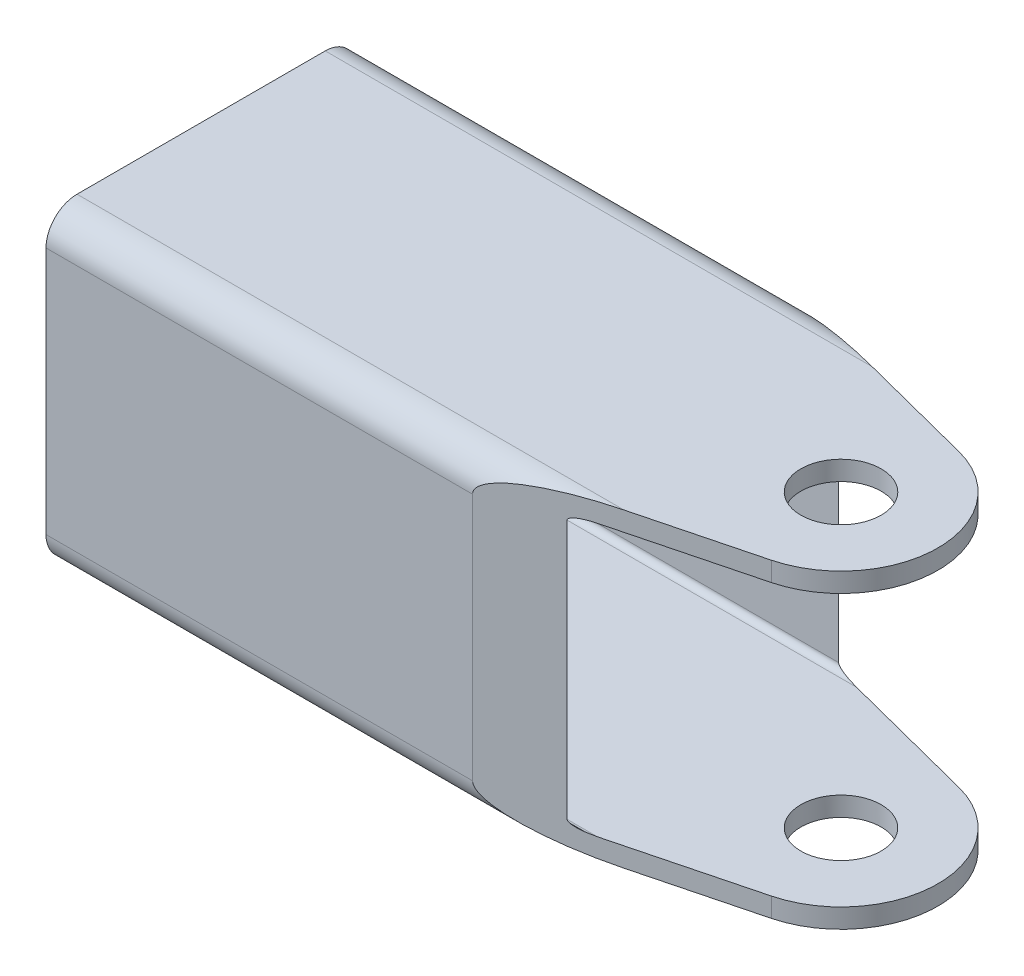
ISO-10303-21;
HEADER;
FILE_DESCRIPTION(('STEP AP214'),'2;1');
FILE_NAME('part.step','',(''),(''),'','','');
FILE_SCHEMA(('AUTOMOTIVE_DESIGN { 1 0 10303 214 1 1 1 1 }'));
ENDSEC;
DATA;
#1=APPLICATION_CONTEXT('core data for automotive mechanical design processes');
#2=APPLICATION_PROTOCOL_DEFINITION('international standard','automotive_design',2000,#1);
#3=PRODUCT_CONTEXT('',#1,'mechanical');
#4=PRODUCT('Part','Part','',(#3));
#5=PRODUCT_RELATED_PRODUCT_CATEGORY('part','',(#4));
#6=PRODUCT_DEFINITION_FORMATION('','',#4);
#7=PRODUCT_DEFINITION_CONTEXT('part definition',#1,'design');
#8=PRODUCT_DEFINITION('design','',#6,#7);
#9=PRODUCT_DEFINITION_SHAPE('','',#8);
#10=(LENGTH_UNIT() NAMED_UNIT(*) SI_UNIT(.MILLI.,.METRE.));
#11=(NAMED_UNIT(*) PLANE_ANGLE_UNIT() SI_UNIT($,.RADIAN.));
#12=(NAMED_UNIT(*) SI_UNIT($,.STERADIAN.) SOLID_ANGLE_UNIT());
#13=UNCERTAINTY_MEASURE_WITH_UNIT(LENGTH_MEASURE(1.E-05),#10,'distance_accuracy_value','');
#14=(GEOMETRIC_REPRESENTATION_CONTEXT(3) GLOBAL_UNCERTAINTY_ASSIGNED_CONTEXT((#13)) GLOBAL_UNIT_ASSIGNED_CONTEXT((#10,
#11,#12)) REPRESENTATION_CONTEXT('',''));
#15=CARTESIAN_POINT('',(0.,0.,0.));
#16=DIRECTION('',(0.,0.,1.));
#17=DIRECTION('',(1.,0.,0.));
#18=AXIS2_PLACEMENT_3D('',#15,#16,#17);
#19=CARTESIAN_POINT('',(-34.925,12.7,10.16));
#20=DIRECTION('',(0.,1.,0.));
#21=DIRECTION('',(0.,0.,1.));
#22=AXIS2_PLACEMENT_3D('',#19,#20,#21);
#23=PLANE('',#22);
#24=CARTESIAN_POINT('',(17.4625,12.7,0.));
#25=DIRECTION('',(0.,1.,0.));
#26=DIRECTION('',(0.,0.,1.));
#27=AXIS2_PLACEMENT_3D('',#24,#25,#26);
#28=CIRCLE('',#27,3.2893);
#29=CARTESIAN_POINT('',(17.4625,12.7,3.2893));
#30=VERTEX_POINT('',#29);
#31=EDGE_CURVE('E478',#30,#30,#28,.T.);
#32=ORIENTED_EDGE('',*,*,#31,.F.);
#33=EDGE_LOOP('',(#32));
#34=FACE_BOUND('',#33,.T.);
#35=CARTESIAN_POINT('',(17.4625,12.7,0.));
#36=DIRECTION('',(0.,1.,0.));
#37=DIRECTION('',(0.,0.,1.));
#38=AXIS2_PLACEMENT_3D('',#35,#36,#37);
#39=CIRCLE('',#38,7.9375);
#40=CARTESIAN_POINT('',(19.4444244631501,12.7,7.68608363683138));
#41=VERTEX_POINT('',#40);
#42=CARTESIAN_POINT('',(19.4444244631501,12.7,-7.68608363683139));
#43=VERTEX_POINT('',#42);
#44=EDGE_CURVE('E203',#41,#43,#39,.T.);
#45=ORIENTED_EDGE('',*,*,#44,.T.);
#46=DIRECTION('',(-0.968325497553561,0.,-0.249691270948044));
#47=VECTOR('',#46,1.);
#48=CARTESIAN_POINT('',(3.07063678702942,12.7,-11.9082092189968));
#49=LINE('',#48,#47);
#50=CARTESIAN_POINT('',(9.85035141375773,12.7,-10.16));
#51=VERTEX_POINT('',#50);
#52=EDGE_CURVE('E210',#43,#51,#49,.T.);
#53=ORIENTED_EDGE('',*,*,#52,.T.);
#54=DIRECTION('',(1.,0.,0.));
#55=VECTOR('',#54,1.);
#56=CARTESIAN_POINT('',(-34.925,12.7,-10.16));
#57=LINE('',#56,#55);
#58=CARTESIAN_POINT('',(-34.925,12.7,-10.16));
#59=VERTEX_POINT('',#58);
#60=EDGE_CURVE('E321',#59,#51,#57,.T.);
#61=ORIENTED_EDGE('',*,*,#60,.F.);
#62=DIRECTION('',(0.,0.,1.));
#63=VECTOR('',#62,1.);
#64=CARTESIAN_POINT('',(-34.925,12.7,10.16));
#65=LINE('',#64,#63);
#66=CARTESIAN_POINT('',(-34.925,12.7,10.16));
#67=VERTEX_POINT('',#66);
#68=EDGE_CURVE('E313',#59,#67,#65,.T.);
#69=ORIENTED_EDGE('',*,*,#68,.T.);
#70=DIRECTION('',(1.,0.,0.));
#71=VECTOR('',#70,1.);
#72=CARTESIAN_POINT('',(-34.925,12.7,10.16));
#73=LINE('',#72,#71);
#74=CARTESIAN_POINT('',(9.85035141375776,12.7,10.16));
#75=VERTEX_POINT('',#74);
#76=EDGE_CURVE('E317',#67,#75,#73,.T.);
#77=ORIENTED_EDGE('',*,*,#76,.T.);
#78=DIRECTION('',(-0.96832549755356,0.,0.249691270948044));
#79=VECTOR('',#78,1.);
#80=CARTESIAN_POINT('',(3.07063678702943,12.7,11.9082092189969));
#81=LINE('',#80,#79);
#82=EDGE_CURVE('E201',#41,#75,#81,.T.);
#83=ORIENTED_EDGE('',*,*,#82,.F.);
#84=EDGE_LOOP('',(#45,#53,#61,#69,#77,#83));
#85=FACE_BOUND('',#84,.T.);
#86=ADVANCED_FACE('F36',(#34,#85),#23,.T.);
#87=CARTESIAN_POINT('',(-34.925,10.16,-10.16));
#88=DIRECTION('',(1.,0.,0.));
#89=DIRECTION('',(0.,0.,-1.));
#90=AXIS2_PLACEMENT_3D('',#87,#88,#89);
#91=CYLINDRICAL_SURFACE('',#90,2.54);
#92=ORIENTED_EDGE('',*,*,#60,.T.);
#93=CARTESIAN_POINT('',(9.85035141375777,10.16,-10.16));
#94=DIRECTION('',(0.249691270948044,0.,-0.968325497553561));
#95=DIRECTION('',(0.968325497553561,0.,0.249691270948044));
#96=AXIS2_PLACEMENT_3D('',#93,#94,#95);
#97=ELLIPSE('',#96,10.1725622620125,2.54);
#98=CARTESIAN_POINT('',(0.,10.16,-12.7));
#99=VERTEX_POINT('',#98);
#100=EDGE_CURVE('E245',#51,#99,#97,.F.);
#101=ORIENTED_EDGE('',*,*,#100,.T.);
#102=DIRECTION('',(1.,0.,0.));
#103=VECTOR('',#102,1.);
#104=CARTESIAN_POINT('',(-34.925,10.16,-12.7));
#105=LINE('',#104,#103);
#106=CARTESIAN_POINT('',(-34.925,10.16,-12.7));
#107=VERTEX_POINT('',#106);
#108=EDGE_CURVE('E324',#107,#99,#105,.T.);
#109=ORIENTED_EDGE('',*,*,#108,.F.);
#110=CARTESIAN_POINT('',(-34.925,10.16,-10.16));
#111=DIRECTION('',(1.,0.,0.));
#112=DIRECTION('',(0.,0.,1.));
#113=AXIS2_PLACEMENT_3D('',#110,#111,#112);
#114=CIRCLE('',#113,2.54);
#115=EDGE_CURVE('E310',#107,#59,#114,.T.);
#116=ORIENTED_EDGE('',*,*,#115,.T.);
#117=EDGE_LOOP('',(#92,#101,#109,#116));
#118=FACE_BOUND('',#117,.T.);
#119=ADVANCED_FACE('F388',(#118),#91,.T.);
#120=CARTESIAN_POINT('',(-34.925,10.16,-12.7));
#121=DIRECTION('',(0.,0.,-1.));
#122=DIRECTION('',(-1.,0.,0.));
#123=AXIS2_PLACEMENT_3D('',#120,#121,#122);
#124=PLANE('',#123);
#125=ORIENTED_EDGE('',*,*,#108,.T.);
#126=DIRECTION('',(0.,1.,0.));
#127=VECTOR('',#126,1.);
#128=CARTESIAN_POINT('',(0.,-12.7,-12.7));
#129=LINE('',#128,#127);
#130=CARTESIAN_POINT('',(0.,-10.16,-12.7));
#131=VERTEX_POINT('',#130);
#132=EDGE_CURVE('E214',#131,#99,#129,.T.);
#133=ORIENTED_EDGE('',*,*,#132,.F.);
#134=DIRECTION('',(1.,0.,0.));
#135=VECTOR('',#134,1.);
#136=CARTESIAN_POINT('',(-34.925,-10.16,-12.7));
#137=LINE('',#136,#135);
#138=CARTESIAN_POINT('',(-34.925,-10.16,-12.7));
#139=VERTEX_POINT('',#138);
#140=EDGE_CURVE('E327',#139,#131,#137,.T.);
#141=ORIENTED_EDGE('',*,*,#140,.F.);
#142=DIRECTION('',(0.,1.,0.));
#143=VECTOR('',#142,1.);
#144=CARTESIAN_POINT('',(-34.925,10.16,-12.7));
#145=LINE('',#144,#143);
#146=EDGE_CURVE('E307',#139,#107,#145,.T.);
#147=ORIENTED_EDGE('',*,*,#146,.T.);
#148=EDGE_LOOP('',(#125,#133,#141,#147));
#149=FACE_BOUND('',#148,.T.);
#150=ADVANCED_FACE('F391',(#149),#124,.T.);
#151=CARTESIAN_POINT('',(-34.925,-10.16,-10.16));
#152=DIRECTION('',(1.,0.,0.));
#153=DIRECTION('',(0.,0.,-1.));
#154=AXIS2_PLACEMENT_3D('',#151,#152,#153);
#155=CYLINDRICAL_SURFACE('',#154,2.54);
#156=ORIENTED_EDGE('',*,*,#140,.T.);
#157=CARTESIAN_POINT('',(9.85035141375777,-10.16,-10.16));
#158=DIRECTION('',(0.249691270948044,0.,-0.968325497553561));
#159=DIRECTION('',(0.968325497553561,0.,0.249691270948044));
#160=AXIS2_PLACEMENT_3D('',#157,#158,#159);
#161=ELLIPSE('',#160,10.1725622620125,2.54);
#162=CARTESIAN_POINT('',(9.85035141375775,-12.7,-10.16));
#163=VERTEX_POINT('',#162);
#164=EDGE_CURVE('E243',#131,#163,#161,.F.);
#165=ORIENTED_EDGE('',*,*,#164,.T.);
#166=DIRECTION('',(1.,0.,0.));
#167=VECTOR('',#166,1.);
#168=CARTESIAN_POINT('',(-34.925,-12.7,-10.16));
#169=LINE('',#168,#167);
#170=CARTESIAN_POINT('',(-34.925,-12.7,-10.16));
#171=VERTEX_POINT('',#170);
#172=EDGE_CURVE('E200',#171,#163,#169,.T.);
#173=ORIENTED_EDGE('',*,*,#172,.F.);
#174=CARTESIAN_POINT('',(-34.925,-10.16,-10.16));
#175=DIRECTION('',(1.,0.,0.));
#176=DIRECTION('',(0.,0.,1.));
#177=AXIS2_PLACEMENT_3D('',#174,#175,#176);
#178=CIRCLE('',#177,2.54);
#179=EDGE_CURVE('E304',#171,#139,#178,.T.);
#180=ORIENTED_EDGE('',*,*,#179,.T.);
#181=EDGE_LOOP('',(#156,#165,#173,#180));
#182=FACE_BOUND('',#181,.T.);
#183=ADVANCED_FACE('F394',(#182),#155,.T.);
#184=CARTESIAN_POINT('',(-34.925,-12.7,10.16));
#185=DIRECTION('',(0.,-1.,0.));
#186=DIRECTION('',(0.,0.,-1.));
#187=AXIS2_PLACEMENT_3D('',#184,#185,#186);
#188=PLANE('',#187);
#189=CARTESIAN_POINT('',(17.4625,-12.7,0.));
#190=DIRECTION('',(0.,1.,0.));
#191=DIRECTION('',(0.,0.,1.));
#192=AXIS2_PLACEMENT_3D('',#189,#190,#191);
#193=CIRCLE('',#192,3.2893);
#194=CARTESIAN_POINT('',(17.4625,-12.7,3.2893));
#195=VERTEX_POINT('',#194);
#196=EDGE_CURVE('E472',#195,#195,#193,.T.);
#197=ORIENTED_EDGE('',*,*,#196,.T.);
#198=EDGE_LOOP('',(#197));
#199=FACE_BOUND('',#198,.T.);
#200=ORIENTED_EDGE('',*,*,#172,.T.);
#201=DIRECTION('',(-0.968325497553561,0.,-0.249691270948044));
#202=VECTOR('',#201,1.);
#203=CARTESIAN_POINT('',(3.07063678702942,-12.7,-11.9082092189968));
#204=LINE('',#203,#202);
#205=CARTESIAN_POINT('',(19.4444244631501,-12.7,-7.68608363683138));
#206=VERTEX_POINT('',#205);
#207=EDGE_CURVE('E186',#206,#163,#204,.T.);
#208=ORIENTED_EDGE('',*,*,#207,.F.);
#209=CARTESIAN_POINT('',(17.4625,-12.7,0.));
#210=DIRECTION('',(0.,1.,0.));
#211=DIRECTION('',(0.,0.,1.));
#212=AXIS2_PLACEMENT_3D('',#209,#210,#211);
#213=CIRCLE('',#212,7.9375);
#214=CARTESIAN_POINT('',(19.4444244631501,-12.7,7.68608363683139));
#215=VERTEX_POINT('',#214);
#216=EDGE_CURVE('E174',#215,#206,#213,.T.);
#217=ORIENTED_EDGE('',*,*,#216,.F.);
#218=DIRECTION('',(-0.96832549755356,0.,0.249691270948044));
#219=VECTOR('',#218,1.);
#220=CARTESIAN_POINT('',(3.07063678702943,-12.7,11.9082092189969));
#221=LINE('',#220,#219);
#222=CARTESIAN_POINT('',(9.85035141375782,-12.7,10.16));
#223=VERTEX_POINT('',#222);
#224=EDGE_CURVE('E185',#215,#223,#221,.T.);
#225=ORIENTED_EDGE('',*,*,#224,.T.);
#226=DIRECTION('',(1.,0.,0.));
#227=VECTOR('',#226,1.);
#228=CARTESIAN_POINT('',(-34.925,-12.7,10.16));
#229=LINE('',#228,#227);
#230=CARTESIAN_POINT('',(-34.925,-12.7,10.16));
#231=VERTEX_POINT('',#230);
#232=EDGE_CURVE('E331',#231,#223,#229,.T.);
#233=ORIENTED_EDGE('',*,*,#232,.F.);
#234=DIRECTION('',(0.,0.,-1.));
#235=VECTOR('',#234,1.);
#236=CARTESIAN_POINT('',(-34.925,-12.7,10.16));
#237=LINE('',#236,#235);
#238=EDGE_CURVE('E302',#231,#171,#237,.T.);
#239=ORIENTED_EDGE('',*,*,#238,.T.);
#240=EDGE_LOOP('',(#200,#208,#217,#225,#233,#239));
#241=FACE_BOUND('',#240,.T.);
#242=ADVANCED_FACE('F198',(#199,#241),#188,.T.);
#243=CARTESIAN_POINT('',(-34.925,10.6045,-10.6045));
#244=DIRECTION('',(1.,0.,0.));
#245=DIRECTION('',(0.,0.,-1.));
#246=AXIS2_PLACEMENT_3D('',#243,#244,#245);
#247=CYLINDRICAL_SURFACE('',#246,0.508000000000001);
#248=CARTESIAN_POINT('',(8.12653991635016,10.6045,-10.6045));
#249=DIRECTION('',(0.249691270948044,0.,-0.968325497553561));
#250=DIRECTION('',(0.968325497553561,0.,0.249691270948044));
#251=AXIS2_PLACEMENT_3D('',#248,#249,#250);
#252=ELLIPSE('',#251,2.0345124524025,0.508000000000001);
#253=CARTESIAN_POINT('',(8.12653991635019,11.1125,-10.6045));
#254=VERTEX_POINT('',#253);
#255=CARTESIAN_POINT('',(6.15646963359859,10.6045,-11.1125));
#256=VERTEX_POINT('',#255);
#257=EDGE_CURVE('E236',#254,#256,#252,.F.);
#258=ORIENTED_EDGE('',*,*,#257,.F.);
#259=DIRECTION('',(1.,0.,0.));
#260=VECTOR('',#259,1.);
#261=CARTESIAN_POINT('',(-34.925,11.1125,-10.6045));
#262=LINE('',#261,#260);
#263=CARTESIAN_POINT('',(-34.925,11.1125,-10.6045));
#264=VERTEX_POINT('',#263);
#265=EDGE_CURVE('E270',#264,#254,#262,.T.);
#266=ORIENTED_EDGE('',*,*,#265,.F.);
#267=CARTESIAN_POINT('',(-34.925,10.6045,-10.6045));
#268=DIRECTION('',(1.,0.,0.));
#269=DIRECTION('',(0.,0.,1.));
#270=AXIS2_PLACEMENT_3D('',#267,#268,#269);
#271=CIRCLE('',#270,0.508000000000001);
#272=CARTESIAN_POINT('',(-34.925,10.6045,-11.1125));
#273=VERTEX_POINT('',#272);
#274=EDGE_CURVE('E248',#273,#264,#271,.T.);
#275=ORIENTED_EDGE('',*,*,#274,.F.);
#276=DIRECTION('',(1.,0.,0.));
#277=VECTOR('',#276,1.);
#278=CARTESIAN_POINT('',(-34.925,10.6045,-11.1125));
#279=LINE('',#278,#277);
#280=EDGE_CURVE('E271',#273,#256,#279,.T.);
#281=ORIENTED_EDGE('',*,*,#280,.T.);
#282=EDGE_LOOP('',(#258,#266,#275,#281));
#283=FACE_BOUND('',#282,.T.);
#284=ADVANCED_FACE('F358',(#283),#247,.F.);
#285=CARTESIAN_POINT('',(-34.925,10.6045,-11.1125));
#286=DIRECTION('',(0.,0.,-1.));
#287=DIRECTION('',(0.,1.,0.));
#288=AXIS2_PLACEMENT_3D('',#285,#286,#287);
#289=PLANE('',#288);
#290=DIRECTION('',(0.,-1.,0.));
#291=VECTOR('',#290,1.);
#292=CARTESIAN_POINT('',(6.1564696335986,10.6045,-11.1125));
#293=LINE('',#292,#291);
#294=CARTESIAN_POINT('',(6.15646963359857,-10.6045,-11.1125));
#295=VERTEX_POINT('',#294);
#296=EDGE_CURVE('E238',#256,#295,#293,.T.);
#297=ORIENTED_EDGE('',*,*,#296,.F.);
#298=ORIENTED_EDGE('',*,*,#280,.F.);
#299=DIRECTION('',(0.,1.,0.));
#300=VECTOR('',#299,1.);
#301=CARTESIAN_POINT('',(-34.925,10.6045,-11.1125));
#302=LINE('',#301,#300);
#303=CARTESIAN_POINT('',(-34.925,-10.6045,-11.1125));
#304=VERTEX_POINT('',#303);
#305=EDGE_CURVE('E267',#304,#273,#302,.T.);
#306=ORIENTED_EDGE('',*,*,#305,.F.);
#307=DIRECTION('',(1.,0.,0.));
#308=VECTOR('',#307,1.);
#309=CARTESIAN_POINT('',(-34.925,-10.6045,-11.1125));
#310=LINE('',#309,#308);
#311=EDGE_CURVE('E275',#304,#295,#310,.T.);
#312=ORIENTED_EDGE('',*,*,#311,.T.);
#313=EDGE_LOOP('',(#297,#298,#306,#312));
#314=FACE_BOUND('',#313,.T.);
#315=ADVANCED_FACE('F363',(#314),#289,.F.);
#316=CARTESIAN_POINT('',(-34.925,-10.6045,-10.6045));
#317=DIRECTION('',(1.,0.,0.));
#318=DIRECTION('',(0.,0.,-1.));
#319=AXIS2_PLACEMENT_3D('',#316,#317,#318);
#320=CYLINDRICAL_SURFACE('',#319,0.508);
#321=CARTESIAN_POINT('',(8.12653991635013,-10.6045,-10.6045));
#322=DIRECTION('',(0.249691270948044,0.,-0.968325497553561));
#323=DIRECTION('',(0.968325497553561,0.,0.249691270948044));
#324=AXIS2_PLACEMENT_3D('',#321,#322,#323);
#325=ELLIPSE('',#324,2.03451245240249,0.508);
#326=CARTESIAN_POINT('',(8.12653991635014,-11.1125,-10.6045));
#327=VERTEX_POINT('',#326);
#328=EDGE_CURVE('E240',#295,#327,#325,.F.);
#329=ORIENTED_EDGE('',*,*,#328,.F.);
#330=ORIENTED_EDGE('',*,*,#311,.F.);
#331=CARTESIAN_POINT('',(-34.925,-10.6045,-10.6045));
#332=DIRECTION('',(1.,0.,0.));
#333=DIRECTION('',(0.,0.,-1.));
#334=AXIS2_PLACEMENT_3D('',#331,#332,#333);
#335=CIRCLE('',#334,0.508);
#336=CARTESIAN_POINT('',(-34.925,-11.1125,-10.6045));
#337=VERTEX_POINT('',#336);
#338=EDGE_CURVE('E264',#337,#304,#335,.T.);
#339=ORIENTED_EDGE('',*,*,#338,.F.);
#340=DIRECTION('',(1.,0.,0.));
#341=VECTOR('',#340,1.);
#342=CARTESIAN_POINT('',(-34.925,-11.1125,-10.6045));
#343=LINE('',#342,#341);
#344=EDGE_CURVE('E278',#337,#327,#343,.T.);
#345=ORIENTED_EDGE('',*,*,#344,.T.);
#346=EDGE_LOOP('',(#329,#330,#339,#345));
#347=FACE_BOUND('',#346,.T.);
#348=ADVANCED_FACE('F367',(#347),#320,.F.);
#349=CARTESIAN_POINT('',(-34.925,-11.1125,10.6045));
#350=DIRECTION('',(0.,-1.,0.));
#351=DIRECTION('',(0.,0.,-1.));
#352=AXIS2_PLACEMENT_3D('',#349,#350,#351);
#353=PLANE('',#352);
#354=CARTESIAN_POINT('',(17.4625,-11.1125,0.));
#355=DIRECTION('',(0.,-1.,0.));
#356=DIRECTION('',(0.,0.,-1.));
#357=AXIS2_PLACEMENT_3D('',#354,#355,#356);
#358=CIRCLE('',#357,3.2893);
#359=CARTESIAN_POINT('',(17.4625,-11.1125,-3.2893));
#360=VERTEX_POINT('',#359);
#361=EDGE_CURVE('E206',#360,#360,#358,.T.);
#362=ORIENTED_EDGE('',*,*,#361,.T.);
#363=EDGE_LOOP('',(#362));
#364=FACE_BOUND('',#363,.T.);
#365=DIRECTION('',(0.968325497553561,0.,0.249691270948044));
#366=VECTOR('',#365,1.);
#367=CARTESIAN_POINT('',(-27.1129568480424,-11.1125,-19.6913150811901));
#368=LINE('',#367,#366);
#369=CARTESIAN_POINT('',(19.4444244631501,-11.1125,-7.68608363683138));
#370=VERTEX_POINT('',#369);
#371=EDGE_CURVE('E193',#327,#370,#368,.T.);
#372=ORIENTED_EDGE('',*,*,#371,.F.);
#373=ORIENTED_EDGE('',*,*,#344,.F.);
#374=DIRECTION('',(0.,0.,-1.));
#375=VECTOR('',#374,1.);
#376=CARTESIAN_POINT('',(-34.925,-11.1125,10.6045));
#377=LINE('',#376,#375);
#378=CARTESIAN_POINT('',(-34.925,-11.1125,10.6045));
#379=VERTEX_POINT('',#378);
#380=EDGE_CURVE('E261',#379,#337,#377,.T.);
#381=ORIENTED_EDGE('',*,*,#380,.F.);
#382=DIRECTION('',(1.,0.,0.));
#383=VECTOR('',#382,1.);
#384=CARTESIAN_POINT('',(-34.925,-11.1125,10.6045));
#385=LINE('',#384,#383);
#386=CARTESIAN_POINT('',(8.12653991635018,-11.1125,10.6045));
#387=VERTEX_POINT('',#386);
#388=EDGE_CURVE('E281',#379,#387,#385,.T.);
#389=ORIENTED_EDGE('',*,*,#388,.T.);
#390=DIRECTION('',(0.96832549755356,0.,-0.249691270948044));
#391=VECTOR('',#390,1.);
#392=CARTESIAN_POINT('',(-32.2409202823815,-11.1125,21.0136056854654));
#393=LINE('',#392,#391);
#394=CARTESIAN_POINT('',(19.4444244631501,-11.1125,7.68608363683139));
#395=VERTEX_POINT('',#394);
#396=EDGE_CURVE('E230',#387,#395,#393,.T.);
#397=ORIENTED_EDGE('',*,*,#396,.T.);
#398=CARTESIAN_POINT('',(17.4625,-11.1125,0.));
#399=DIRECTION('',(0.,-1.,0.));
#400=DIRECTION('',(0.,0.,-1.));
#401=AXIS2_PLACEMENT_3D('',#398,#399,#400);
#402=CIRCLE('',#401,7.9375);
#403=EDGE_CURVE('E216',#370,#395,#402,.T.);
#404=ORIENTED_EDGE('',*,*,#403,.F.);
#405=EDGE_LOOP('',(#372,#373,#381,#389,#397,#404));
#406=FACE_BOUND('',#405,.T.);
#407=ADVANCED_FACE('F369',(#364,#406),#353,.F.);
#408=CARTESIAN_POINT('',(-34.925,11.1125,10.6045));
#409=DIRECTION('',(0.,1.,0.));
#410=DIRECTION('',(0.,0.,1.));
#411=AXIS2_PLACEMENT_3D('',#408,#409,#410);
#412=PLANE('',#411);
#413=CARTESIAN_POINT('',(17.4625,11.1125,0.));
#414=DIRECTION('',(0.,1.,0.));
#415=DIRECTION('',(0.,0.,1.));
#416=AXIS2_PLACEMENT_3D('',#413,#414,#415);
#417=CIRCLE('',#416,3.2893);
#418=CARTESIAN_POINT('',(17.4625,11.1125,3.2893));
#419=VERTEX_POINT('',#418);
#420=EDGE_CURVE('E40',#419,#419,#417,.T.);
#421=ORIENTED_EDGE('',*,*,#420,.T.);
#422=EDGE_LOOP('',(#421));
#423=FACE_BOUND('',#422,.T.);
#424=DIRECTION('',(-0.968325497553561,0.,-0.249691270948044));
#425=VECTOR('',#424,1.);
#426=CARTESIAN_POINT('',(-27.1129568480424,11.1125,-19.6913150811901));
#427=LINE('',#426,#425);
#428=CARTESIAN_POINT('',(19.4444244631501,11.1125,-7.68608363683139));
#429=VERTEX_POINT('',#428);
#430=EDGE_CURVE('E11',#429,#254,#427,.T.);
#431=ORIENTED_EDGE('',*,*,#430,.F.);
#432=CARTESIAN_POINT('',(17.4625,11.1125,0.));
#433=DIRECTION('',(0.,1.,0.));
#434=DIRECTION('',(0.,0.,1.));
#435=AXIS2_PLACEMENT_3D('',#432,#433,#434);
#436=CIRCLE('',#435,7.9375);
#437=CARTESIAN_POINT('',(19.4444244631501,11.1125,7.68608363683138));
#438=VERTEX_POINT('',#437);
#439=EDGE_CURVE('E320',#438,#429,#436,.T.);
#440=ORIENTED_EDGE('',*,*,#439,.F.);
#441=DIRECTION('',(-0.96832549755356,0.,0.249691270948044));
#442=VECTOR('',#441,1.);
#443=CARTESIAN_POINT('',(-32.2409202823815,11.1125,21.0136056854654));
#444=LINE('',#443,#442);
#445=CARTESIAN_POINT('',(8.12653991635014,11.1125,10.6045));
#446=VERTEX_POINT('',#445);
#447=EDGE_CURVE('E45',#438,#446,#444,.T.);
#448=ORIENTED_EDGE('',*,*,#447,.T.);
#449=DIRECTION('',(1.,0.,0.));
#450=VECTOR('',#449,1.);
#451=CARTESIAN_POINT('',(-34.925,11.1125,10.6045));
#452=LINE('',#451,#450);
#453=CARTESIAN_POINT('',(-34.925,11.1125,10.6045));
#454=VERTEX_POINT('',#453);
#455=EDGE_CURVE('E290',#454,#446,#452,.T.);
#456=ORIENTED_EDGE('',*,*,#455,.F.);
#457=DIRECTION('',(0.,0.,1.));
#458=VECTOR('',#457,1.);
#459=CARTESIAN_POINT('',(-34.925,11.1125,10.6045));
#460=LINE('',#459,#458);
#461=EDGE_CURVE('E251',#264,#454,#460,.T.);
#462=ORIENTED_EDGE('',*,*,#461,.F.);
#463=ORIENTED_EDGE('',*,*,#265,.T.);
#464=EDGE_LOOP('',(#431,#440,#448,#456,#462,#463));
#465=FACE_BOUND('',#464,.T.);
#466=ADVANCED_FACE('F344',(#423,#465),#412,.F.);
#467=CARTESIAN_POINT('',(-34.925,10.16,10.16));
#468=DIRECTION('',(1.,0.,0.));
#469=DIRECTION('',(0.,0.,-1.));
#470=AXIS2_PLACEMENT_3D('',#467,#468,#469);
#471=CYLINDRICAL_SURFACE('',#470,2.54);
#472=CARTESIAN_POINT('',(9.85035141375779,10.16,10.16));
#473=DIRECTION('',(-0.249691270948044,0.,-0.96832549755356));
#474=DIRECTION('',(0.96832549755356,0.,-0.249691270948044));
#475=AXIS2_PLACEMENT_3D('',#472,#473,#474);
#476=ELLIPSE('',#475,10.1725622620125,2.54);
#477=CARTESIAN_POINT('',(0.,10.16,12.7));
#478=VERTEX_POINT('',#477);
#479=EDGE_CURVE('E52',#75,#478,#476,.F.);
#480=ORIENTED_EDGE('',*,*,#479,.F.);
#481=ORIENTED_EDGE('',*,*,#76,.F.);
#482=CARTESIAN_POINT('',(-34.925,10.16,10.16));
#483=DIRECTION('',(1.,0.,0.));
#484=DIRECTION('',(0.,0.,-1.));
#485=AXIS2_PLACEMENT_3D('',#482,#483,#484);
#486=CIRCLE('',#485,2.54);
#487=CARTESIAN_POINT('',(-34.925,10.16,12.7));
#488=VERTEX_POINT('',#487);
#489=EDGE_CURVE('E274',#67,#488,#486,.T.);
#490=ORIENTED_EDGE('',*,*,#489,.T.);
#491=DIRECTION('',(1.,0.,0.));
#492=VECTOR('',#491,1.);
#493=CARTESIAN_POINT('',(-34.925,10.16,12.7));
#494=LINE('',#493,#492);
#495=EDGE_CURVE('E316',#488,#478,#494,.T.);
#496=ORIENTED_EDGE('',*,*,#495,.T.);
#497=EDGE_LOOP('',(#480,#481,#490,#496));
#498=FACE_BOUND('',#497,.T.);
#499=ADVANCED_FACE('F38',(#498),#471,.T.);
#500=CARTESIAN_POINT('',(-34.925,-10.16,10.16));
#501=DIRECTION('',(1.,0.,0.));
#502=DIRECTION('',(0.,0.,-1.));
#503=AXIS2_PLACEMENT_3D('',#500,#501,#502);
#504=CYLINDRICAL_SURFACE('',#503,2.54);
#505=CARTESIAN_POINT('',(9.8503514137578,-10.16,10.16));
#506=DIRECTION('',(-0.249691270948044,0.,-0.96832549755356));
#507=DIRECTION('',(0.96832549755356,0.,-0.249691270948044));
#508=AXIS2_PLACEMENT_3D('',#505,#506,#507);
#509=ELLIPSE('',#508,10.1725622620125,2.54);
#510=CARTESIAN_POINT('',(0.,-10.16,12.7));
#511=VERTEX_POINT('',#510);
#512=EDGE_CURVE('E233',#511,#223,#509,.F.);
#513=ORIENTED_EDGE('',*,*,#512,.F.);
#514=DIRECTION('',(1.,0.,0.));
#515=VECTOR('',#514,1.);
#516=CARTESIAN_POINT('',(-34.925,-10.16,12.7));
#517=LINE('',#516,#515);
#518=CARTESIAN_POINT('',(-34.925,-10.16,12.7));
#519=VERTEX_POINT('',#518);
#520=EDGE_CURVE('E334',#519,#511,#517,.T.);
#521=ORIENTED_EDGE('',*,*,#520,.F.);
#522=CARTESIAN_POINT('',(-34.925,-10.16,10.16));
#523=DIRECTION('',(1.,0.,0.));
#524=DIRECTION('',(0.,0.,1.));
#525=AXIS2_PLACEMENT_3D('',#522,#523,#524);
#526=CIRCLE('',#525,2.54);
#527=EDGE_CURVE('E299',#519,#231,#526,.T.);
#528=ORIENTED_EDGE('',*,*,#527,.T.);
#529=ORIENTED_EDGE('',*,*,#232,.T.);
#530=EDGE_LOOP('',(#513,#521,#528,#529));
#531=FACE_BOUND('',#530,.T.);
#532=ADVANCED_FACE('F375',(#531),#504,.T.);
#533=CARTESIAN_POINT('',(-34.925,10.16,12.7));
#534=DIRECTION('',(0.,0.,1.));
#535=DIRECTION('',(1.,0.,0.));
#536=AXIS2_PLACEMENT_3D('',#533,#534,#535);
#537=PLANE('',#536);
#538=DIRECTION('',(0.,1.,0.));
#539=VECTOR('',#538,1.);
#540=CARTESIAN_POINT('',(0.,-12.7,12.7));
#541=LINE('',#540,#539);
#542=EDGE_CURVE('E217',#511,#478,#541,.T.);
#543=ORIENTED_EDGE('',*,*,#542,.T.);
#544=ORIENTED_EDGE('',*,*,#495,.F.);
#545=DIRECTION('',(0.,-1.,0.));
#546=VECTOR('',#545,1.);
#547=CARTESIAN_POINT('',(-34.925,10.16,12.7));
#548=LINE('',#547,#546);
#549=EDGE_CURVE('E296',#488,#519,#548,.T.);
#550=ORIENTED_EDGE('',*,*,#549,.T.);
#551=ORIENTED_EDGE('',*,*,#520,.T.);
#552=EDGE_LOOP('',(#543,#544,#550,#551));
#553=FACE_BOUND('',#552,.T.);
#554=ADVANCED_FACE('F381',(#553),#537,.T.);
#555=CARTESIAN_POINT('',(-34.925,10.16,10.16));
#556=DIRECTION('',(1.,0.,0.));
#557=DIRECTION('',(0.,0.,-1.));
#558=AXIS2_PLACEMENT_3D('',#555,#556,#557);
#559=PLANE('',#558);
#560=ORIENTED_EDGE('',*,*,#305,.T.);
#561=ORIENTED_EDGE('',*,*,#274,.T.);
#562=ORIENTED_EDGE('',*,*,#461,.T.);
#563=CARTESIAN_POINT('',(-34.925,10.6045,10.6045));
#564=DIRECTION('',(1.,0.,0.));
#565=DIRECTION('',(0.,0.,-1.));
#566=AXIS2_PLACEMENT_3D('',#563,#564,#565);
#567=CIRCLE('',#566,0.507999999999997);
#568=CARTESIAN_POINT('',(-34.925,10.6045,11.1125));
#569=VERTEX_POINT('',#568);
#570=EDGE_CURVE('E60',#454,#569,#567,.T.);
#571=ORIENTED_EDGE('',*,*,#570,.T.);
#572=DIRECTION('',(0.,-1.,0.));
#573=VECTOR('',#572,1.);
#574=CARTESIAN_POINT('',(-34.925,10.6045,11.1125));
#575=LINE('',#574,#573);
#576=CARTESIAN_POINT('',(-34.925,-10.6045,11.1125));
#577=VERTEX_POINT('',#576);
#578=EDGE_CURVE('E255',#569,#577,#575,.T.);
#579=ORIENTED_EDGE('',*,*,#578,.T.);
#580=CARTESIAN_POINT('',(-34.925,-10.6045,10.6045));
#581=DIRECTION('',(1.,0.,0.));
#582=DIRECTION('',(0.,0.,-1.));
#583=AXIS2_PLACEMENT_3D('',#580,#581,#582);
#584=CIRCLE('',#583,0.508000000000001);
#585=EDGE_CURVE('E258',#577,#379,#584,.T.);
#586=ORIENTED_EDGE('',*,*,#585,.T.);
#587=ORIENTED_EDGE('',*,*,#380,.T.);
#588=ORIENTED_EDGE('',*,*,#338,.T.);
#589=EDGE_LOOP('',(#560,#561,#562,#571,#579,#586,#587,#588));
#590=FACE_BOUND('',#589,.T.);
#591=ORIENTED_EDGE('',*,*,#489,.F.);
#592=ORIENTED_EDGE('',*,*,#68,.F.);
#593=ORIENTED_EDGE('',*,*,#115,.F.);
#594=ORIENTED_EDGE('',*,*,#146,.F.);
#595=ORIENTED_EDGE('',*,*,#179,.F.);
#596=ORIENTED_EDGE('',*,*,#238,.F.);
#597=ORIENTED_EDGE('',*,*,#527,.F.);
#598=ORIENTED_EDGE('',*,*,#549,.F.);
#599=EDGE_LOOP('',(#591,#592,#593,#594,#595,#596,#597,#598));
#600=FACE_BOUND('',#599,.T.);
#601=ADVANCED_FACE('F353',(#590,#600),#559,.F.);
#602=CARTESIAN_POINT('',(-34.925,-10.6045,10.6045));
#603=DIRECTION('',(1.,0.,0.));
#604=DIRECTION('',(0.,0.,-1.));
#605=AXIS2_PLACEMENT_3D('',#602,#603,#604);
#606=CYLINDRICAL_SURFACE('',#605,0.508000000000001);
#607=DIRECTION('',(1.,0.,0.));
#608=VECTOR('',#607,1.);
#609=CARTESIAN_POINT('',(-34.925,-10.6045,11.1125));
#610=LINE('',#609,#608);
#611=CARTESIAN_POINT('',(6.15646963359864,-10.6045,11.1125));
#612=VERTEX_POINT('',#611);
#613=EDGE_CURVE('E284',#577,#612,#610,.T.);
#614=ORIENTED_EDGE('',*,*,#613,.T.);
#615=CARTESIAN_POINT('',(8.12653991635019,-10.6045,10.6045));
#616=DIRECTION('',(-0.249691270948044,0.,-0.96832549755356));
#617=DIRECTION('',(0.968325497553561,0.,-0.249691270948044));
#618=AXIS2_PLACEMENT_3D('',#615,#616,#617);
#619=ELLIPSE('',#618,2.03451245240249,0.508000000000001);
#620=EDGE_CURVE('E227',#612,#387,#619,.F.);
#621=ORIENTED_EDGE('',*,*,#620,.T.);
#622=ORIENTED_EDGE('',*,*,#388,.F.);
#623=ORIENTED_EDGE('',*,*,#585,.F.);
#624=EDGE_LOOP('',(#614,#621,#622,#623));
#625=FACE_BOUND('',#624,.T.);
#626=ADVANCED_FACE('F434',(#625),#606,.F.);
#627=CARTESIAN_POINT('',(-34.925,10.6045,11.1125));
#628=DIRECTION('',(0.,0.,1.));
#629=DIRECTION('',(1.,0.,0.));
#630=AXIS2_PLACEMENT_3D('',#627,#628,#629);
#631=PLANE('',#630);
#632=DIRECTION('',(1.,0.,0.));
#633=VECTOR('',#632,1.);
#634=CARTESIAN_POINT('',(-34.925,10.6045,11.1125));
#635=LINE('',#634,#633);
#636=CARTESIAN_POINT('',(6.1564696335986,10.6045,11.1125));
#637=VERTEX_POINT('',#636);
#638=EDGE_CURVE('E287',#569,#637,#635,.T.);
#639=ORIENTED_EDGE('',*,*,#638,.T.);
#640=DIRECTION('',(0.,-1.,0.));
#641=VECTOR('',#640,1.);
#642=CARTESIAN_POINT('',(6.15646963359863,10.6045,11.1125));
#643=LINE('',#642,#641);
#644=EDGE_CURVE('E224',#637,#612,#643,.T.);
#645=ORIENTED_EDGE('',*,*,#644,.T.);
#646=ORIENTED_EDGE('',*,*,#613,.F.);
#647=ORIENTED_EDGE('',*,*,#578,.F.);
#648=EDGE_LOOP('',(#639,#645,#646,#647));
#649=FACE_BOUND('',#648,.T.);
#650=ADVANCED_FACE('F350',(#649),#631,.F.);
#651=CARTESIAN_POINT('',(-34.925,10.6045,10.6045));
#652=DIRECTION('',(1.,0.,0.));
#653=DIRECTION('',(0.,0.,-1.));
#654=AXIS2_PLACEMENT_3D('',#651,#652,#653);
#655=CYLINDRICAL_SURFACE('',#654,0.507999999999997);
#656=ORIENTED_EDGE('',*,*,#455,.T.);
#657=CARTESIAN_POINT('',(8.12653991635015,10.6045,10.6045));
#658=DIRECTION('',(-0.249691270948044,0.,-0.96832549755356));
#659=DIRECTION('',(0.968325497553561,0.,-0.249691270948044));
#660=AXIS2_PLACEMENT_3D('',#657,#658,#659);
#661=ELLIPSE('',#660,2.03451245240248,0.507999999999997);
#662=EDGE_CURVE('E221',#446,#637,#661,.F.);
#663=ORIENTED_EDGE('',*,*,#662,.T.);
#664=ORIENTED_EDGE('',*,*,#638,.F.);
#665=ORIENTED_EDGE('',*,*,#570,.F.);
#666=EDGE_LOOP('',(#656,#663,#664,#665));
#667=FACE_BOUND('',#666,.T.);
#668=ADVANCED_FACE('F347',(#667),#655,.F.);
#669=CARTESIAN_POINT('',(3.07063678702942,-12.7,-11.9082092189968));
#670=DIRECTION('',(0.249691270948044,0.,-0.968325497553561));
#671=DIRECTION('',(-0.968325497553561,0.,-0.249691270948044));
#672=AXIS2_PLACEMENT_3D('',#669,#670,#671);
#673=PLANE('',#672);
#674=ORIENTED_EDGE('',*,*,#52,.F.);
#675=DIRECTION('',(0.,1.,0.));
#676=VECTOR('',#675,1.);
#677=CARTESIAN_POINT('',(19.4444244631501,-12.7,-7.68608363683138));
#678=LINE('',#677,#676);
#679=EDGE_CURVE('E195',#429,#43,#678,.T.);
#680=ORIENTED_EDGE('',*,*,#679,.F.);
#681=ORIENTED_EDGE('',*,*,#430,.T.);
#682=ORIENTED_EDGE('',*,*,#257,.T.);
#683=ORIENTED_EDGE('',*,*,#296,.T.);
#684=ORIENTED_EDGE('',*,*,#328,.T.);
#685=ORIENTED_EDGE('',*,*,#371,.T.);
#686=EDGE_CURVE('E177',#206,#370,#678,.T.);
#687=ORIENTED_EDGE('',*,*,#686,.F.);
#688=ORIENTED_EDGE('',*,*,#207,.T.);
#689=ORIENTED_EDGE('',*,*,#164,.F.);
#690=ORIENTED_EDGE('',*,*,#132,.T.);
#691=ORIENTED_EDGE('',*,*,#100,.F.);
#692=EDGE_LOOP('',(#674,#680,#681,#682,#683,#684,#685,#687,#688,#689,#690,#691));
#693=FACE_BOUND('',#692,.T.);
#694=ADVANCED_FACE('F190',(#693),#673,.T.);
#695=CARTESIAN_POINT('',(3.07063678702943,-12.7,11.9082092189969));
#696=DIRECTION('',(-0.249691270948044,0.,-0.96832549755356));
#697=DIRECTION('',(-0.968325497553561,0.,0.249691270948044));
#698=AXIS2_PLACEMENT_3D('',#695,#696,#697);
#699=PLANE('',#698);
#700=ORIENTED_EDGE('',*,*,#479,.T.);
#701=ORIENTED_EDGE('',*,*,#542,.F.);
#702=ORIENTED_EDGE('',*,*,#512,.T.);
#703=ORIENTED_EDGE('',*,*,#224,.F.);
#704=DIRECTION('',(0.,1.,0.));
#705=VECTOR('',#704,1.);
#706=CARTESIAN_POINT('',(19.4444244631501,-12.7,7.68608363683139));
#707=LINE('',#706,#705);
#708=EDGE_CURVE('E180',#215,#395,#707,.T.);
#709=ORIENTED_EDGE('',*,*,#708,.T.);
#710=ORIENTED_EDGE('',*,*,#396,.F.);
#711=ORIENTED_EDGE('',*,*,#620,.F.);
#712=ORIENTED_EDGE('',*,*,#644,.F.);
#713=ORIENTED_EDGE('',*,*,#662,.F.);
#714=ORIENTED_EDGE('',*,*,#447,.F.);
#715=EDGE_CURVE('E194',#438,#41,#707,.T.);
#716=ORIENTED_EDGE('',*,*,#715,.T.);
#717=ORIENTED_EDGE('',*,*,#82,.T.);
#718=EDGE_LOOP('',(#700,#701,#702,#703,#709,#710,#711,#712,#713,#714,#716,#717));
#719=FACE_BOUND('',#718,.T.);
#720=ADVANCED_FACE('F371',(#719),#699,.F.);
#721=CARTESIAN_POINT('',(17.4625,-12.7,0.));
#722=DIRECTION('',(0.,1.,0.));
#723=DIRECTION('',(0.,0.,1.));
#724=AXIS2_PLACEMENT_3D('',#721,#722,#723);
#725=CYLINDRICAL_SURFACE('',#724,7.9375);
#726=ORIENTED_EDGE('',*,*,#708,.F.);
#727=ORIENTED_EDGE('',*,*,#216,.T.);
#728=ORIENTED_EDGE('',*,*,#686,.T.);
#729=ORIENTED_EDGE('',*,*,#403,.T.);
#730=EDGE_LOOP('',(#726,#727,#728,#729));
#731=FACE_BOUND('',#730,.T.);
#732=ADVANCED_FACE('F176',(#731),#725,.T.);
#733=ORIENTED_EDGE('',*,*,#715,.F.);
#734=ORIENTED_EDGE('',*,*,#439,.T.);
#735=ORIENTED_EDGE('',*,*,#679,.T.);
#736=ORIENTED_EDGE('',*,*,#44,.F.);
#737=EDGE_LOOP('',(#733,#734,#735,#736));
#738=FACE_BOUND('',#737,.T.);
#739=ADVANCED_FACE('F398',(#738),#725,.T.);
#740=CARTESIAN_POINT('',(17.4625,-12.7,0.));
#741=DIRECTION('',(0.,1.,0.));
#742=DIRECTION('',(0.,0.,1.));
#743=AXIS2_PLACEMENT_3D('',#740,#741,#742);
#744=CYLINDRICAL_SURFACE('',#743,3.2893);
#745=ORIENTED_EDGE('',*,*,#31,.T.);
#746=EDGE_LOOP('',(#745));
#747=FACE_BOUND('',#746,.T.);
#748=ORIENTED_EDGE('',*,*,#420,.F.);
#749=EDGE_LOOP('',(#748));
#750=FACE_BOUND('',#749,.T.);
#751=ADVANCED_FACE('F400',(#747,#750),#744,.F.);
#752=ORIENTED_EDGE('',*,*,#196,.F.);
#753=EDGE_LOOP('',(#752));
#754=FACE_BOUND('',#753,.T.);
#755=ORIENTED_EDGE('',*,*,#361,.F.);
#756=EDGE_LOOP('',(#755));
#757=FACE_BOUND('',#756,.T.);
#758=ADVANCED_FACE('F406',(#754,#757),#744,.F.);
#759=CLOSED_SHELL('',(#86,#119,#150,#183,#242,#284,#315,#348,#407,#466,#499,#532,#554,#601,#626,
#650,#668,#694,#720,#732,#739,#751,#758));
#760=MANIFOLD_SOLID_BREP('B2',#759);
#761=ADVANCED_BREP_SHAPE_REPRESENTATION('',(#18,#760),#14);
#762=SHAPE_DEFINITION_REPRESENTATION(#9,#761);
ENDSEC;
END-ISO-10303-21;
